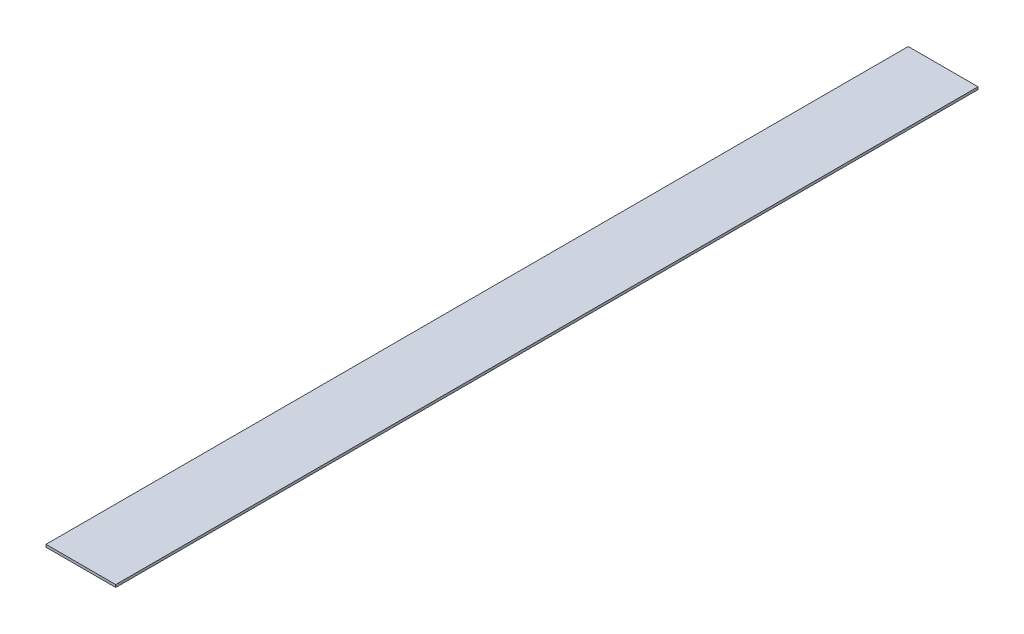
ISO-10303-21;
HEADER;
FILE_DESCRIPTION(('STEP AP214'),'2;1');
FILE_NAME('part.step','',(''),(''),'','','');
FILE_SCHEMA(('AUTOMOTIVE_DESIGN { 1 0 10303 214 1 1 1 1 }'));
ENDSEC;
DATA;
#1=APPLICATION_CONTEXT('core data for automotive mechanical design processes');
#2=APPLICATION_PROTOCOL_DEFINITION('international standard','automotive_design',2000,#1);
#3=PRODUCT_CONTEXT('',#1,'mechanical');
#4=PRODUCT('Part','Part','',(#3));
#5=PRODUCT_RELATED_PRODUCT_CATEGORY('part','',(#4));
#6=PRODUCT_DEFINITION_FORMATION('','',#4);
#7=PRODUCT_DEFINITION_CONTEXT('part definition',#1,'design');
#8=PRODUCT_DEFINITION('design','',#6,#7);
#9=PRODUCT_DEFINITION_SHAPE('','',#8);
#10=(LENGTH_UNIT() NAMED_UNIT(*) SI_UNIT(.MILLI.,.METRE.));
#11=(NAMED_UNIT(*) PLANE_ANGLE_UNIT() SI_UNIT($,.RADIAN.));
#12=(NAMED_UNIT(*) SI_UNIT($,.STERADIAN.) SOLID_ANGLE_UNIT());
#13=UNCERTAINTY_MEASURE_WITH_UNIT(LENGTH_MEASURE(1.E-05),#10,'distance_accuracy_value','');
#14=(GEOMETRIC_REPRESENTATION_CONTEXT(3) GLOBAL_UNCERTAINTY_ASSIGNED_CONTEXT((#13)) GLOBAL_UNIT_ASSIGNED_CONTEXT((#10,
#11,#12)) REPRESENTATION_CONTEXT('',''));
#15=CARTESIAN_POINT('',(0.,0.,0.));
#16=DIRECTION('',(0.,0.,1.));
#17=DIRECTION('',(1.,0.,0.));
#18=AXIS2_PLACEMENT_3D('',#15,#16,#17);
#19=CARTESIAN_POINT('',(-27.5,-1.,560.));
#20=DIRECTION('',(-1.,0.,0.));
#21=DIRECTION('',(0.,0.,1.));
#22=AXIS2_PLACEMENT_3D('',#19,#20,#21);
#23=PLANE('',#22);
#24=DIRECTION('',(0.,-1.,0.));
#25=VECTOR('',#24,1.);
#26=CARTESIAN_POINT('',(-27.5,-1.,80.));
#27=LINE('',#26,#25);
#28=CARTESIAN_POINT('',(-27.5,1.,80.));
#29=VERTEX_POINT('',#28);
#30=CARTESIAN_POINT('',(-27.5,-1.,80.));
#31=VERTEX_POINT('',#30);
#32=EDGE_CURVE('E98',#29,#31,#27,.T.);
#33=ORIENTED_EDGE('',*,*,#32,.F.);
#34=DIRECTION('',(0.,0.,-1.));
#35=VECTOR('',#34,1.);
#36=CARTESIAN_POINT('',(-27.5,1.,560.));
#37=LINE('',#36,#35);
#38=CARTESIAN_POINT('',(-27.5,1.,-600.));
#39=VERTEX_POINT('',#38);
#40=EDGE_CURVE('E105',#29,#39,#37,.T.);
#41=ORIENTED_EDGE('',*,*,#40,.T.);
#42=DIRECTION('',(0.,1.,0.));
#43=VECTOR('',#42,1.);
#44=CARTESIAN_POINT('',(-27.5,-1.,-600.));
#45=LINE('',#44,#43);
#46=CARTESIAN_POINT('',(-27.5,-1.,-600.));
#47=VERTEX_POINT('',#46);
#48=EDGE_CURVE('E114',#47,#39,#45,.T.);
#49=ORIENTED_EDGE('',*,*,#48,.F.);
#50=DIRECTION('',(0.,0.,-1.));
#51=VECTOR('',#50,1.);
#52=CARTESIAN_POINT('',(-27.5,-1.,560.));
#53=LINE('',#52,#51);
#54=EDGE_CURVE('E66',#31,#47,#53,.T.);
#55=ORIENTED_EDGE('',*,*,#54,.F.);
#56=EDGE_LOOP('',(#33,#41,#49,#55));
#57=FACE_BOUND('',#56,.T.);
#58=ADVANCED_FACE('F57',(#57),#23,.T.);
#59=CARTESIAN_POINT('',(27.5,1.00000000000001,560.));
#60=DIRECTION('',(1.,0.,0.));
#61=DIRECTION('',(0.,0.,-1.));
#62=AXIS2_PLACEMENT_3D('',#59,#60,#61);
#63=PLANE('',#62);
#64=DIRECTION('',(0.,1.,0.));
#65=VECTOR('',#64,1.);
#66=CARTESIAN_POINT('',(27.5,-0.99999999999999,80.));
#67=LINE('',#66,#65);
#68=CARTESIAN_POINT('',(27.5,-0.99999999999999,80.));
#69=VERTEX_POINT('',#68);
#70=CARTESIAN_POINT('',(27.5,1.00000000000001,80.));
#71=VERTEX_POINT('',#70);
#72=EDGE_CURVE('E80',#69,#71,#67,.T.);
#73=ORIENTED_EDGE('',*,*,#72,.F.);
#74=DIRECTION('',(0.,0.,-1.));
#75=VECTOR('',#74,1.);
#76=CARTESIAN_POINT('',(27.5,-0.99999999999999,560.));
#77=LINE('',#76,#75);
#78=CARTESIAN_POINT('',(27.5,-0.99999999999999,-600.));
#79=VERTEX_POINT('',#78);
#80=EDGE_CURVE('E61',#69,#79,#77,.T.);
#81=ORIENTED_EDGE('',*,*,#80,.T.);
#82=DIRECTION('',(0.,-1.,0.));
#83=VECTOR('',#82,1.);
#84=CARTESIAN_POINT('',(27.5,1.00000000000001,-600.));
#85=LINE('',#84,#83);
#86=CARTESIAN_POINT('',(27.5,1.00000000000001,-600.));
#87=VERTEX_POINT('',#86);
#88=EDGE_CURVE('E107',#87,#79,#85,.T.);
#89=ORIENTED_EDGE('',*,*,#88,.F.);
#90=DIRECTION('',(0.,0.,-1.));
#91=VECTOR('',#90,1.);
#92=CARTESIAN_POINT('',(27.5,1.00000000000001,560.));
#93=LINE('',#92,#91);
#94=EDGE_CURVE('E118',#71,#87,#93,.T.);
#95=ORIENTED_EDGE('',*,*,#94,.F.);
#96=EDGE_LOOP('',(#73,#81,#89,#95));
#97=FACE_BOUND('',#96,.T.);
#98=ADVANCED_FACE('F131',(#97),#63,.T.);
#99=CARTESIAN_POINT('',(27.5,-0.99999999999999,80.));
#100=DIRECTION('',(0.,0.,-1.));
#101=DIRECTION('',(-1.,0.,0.));
#102=AXIS2_PLACEMENT_3D('',#99,#100,#101);
#103=PLANE('',#102);
#104=DIRECTION('',(-1.,0.,0.));
#105=VECTOR('',#104,1.);
#106=CARTESIAN_POINT('',(27.5,1.00000000000001,80.));
#107=LINE('',#106,#105);
#108=EDGE_CURVE('E95',#71,#29,#107,.T.);
#109=ORIENTED_EDGE('',*,*,#108,.T.);
#110=ORIENTED_EDGE('',*,*,#32,.T.);
#111=DIRECTION('',(-1.,0.,0.));
#112=VECTOR('',#111,1.);
#113=CARTESIAN_POINT('',(27.5,-0.99999999999999,80.));
#114=LINE('',#113,#112);
#115=EDGE_CURVE('E12',#69,#31,#114,.T.);
#116=ORIENTED_EDGE('',*,*,#115,.F.);
#117=ORIENTED_EDGE('',*,*,#72,.T.);
#118=EDGE_LOOP('',(#109,#110,#116,#117));
#119=FACE_BOUND('',#118,.T.);
#120=ADVANCED_FACE('F97',(#119),#103,.F.);
#121=CARTESIAN_POINT('',(-27.5,1.,560.));
#122=DIRECTION('',(0.,1.,0.));
#123=DIRECTION('',(-1.,0.,0.));
#124=AXIS2_PLACEMENT_3D('',#121,#122,#123);
#125=PLANE('',#124);
#126=ORIENTED_EDGE('',*,*,#40,.F.);
#127=ORIENTED_EDGE('',*,*,#108,.F.);
#128=ORIENTED_EDGE('',*,*,#94,.T.);
#129=DIRECTION('',(1.,0.,0.));
#130=VECTOR('',#129,1.);
#131=CARTESIAN_POINT('',(-27.5,1.,-600.));
#132=LINE('',#131,#130);
#133=EDGE_CURVE('E112',#39,#87,#132,.T.);
#134=ORIENTED_EDGE('',*,*,#133,.F.);
#135=EDGE_LOOP('',(#126,#127,#128,#134));
#136=FACE_BOUND('',#135,.T.);
#137=ADVANCED_FACE('F110',(#136),#125,.T.);
#138=CARTESIAN_POINT('',(-27.5,-1.,560.));
#139=DIRECTION('',(0.,1.,0.));
#140=DIRECTION('',(-1.,0.,0.));
#141=AXIS2_PLACEMENT_3D('',#138,#139,#140);
#142=PLANE('',#141);
#143=ORIENTED_EDGE('',*,*,#115,.T.);
#144=ORIENTED_EDGE('',*,*,#54,.T.);
#145=DIRECTION('',(-1.,0.,0.));
#146=VECTOR('',#145,1.);
#147=CARTESIAN_POINT('',(27.5,-0.99999999999999,-600.));
#148=LINE('',#147,#146);
#149=EDGE_CURVE('E124',#79,#47,#148,.T.);
#150=ORIENTED_EDGE('',*,*,#149,.F.);
#151=ORIENTED_EDGE('',*,*,#80,.F.);
#152=EDGE_LOOP('',(#143,#144,#150,#151));
#153=FACE_BOUND('',#152,.T.);
#154=ADVANCED_FACE('F59',(#153),#142,.F.);
#155=CARTESIAN_POINT('',(0.,0.,-600.));
#156=DIRECTION('',(0.,0.,-1.));
#157=DIRECTION('',(-1.,0.,0.));
#158=AXIS2_PLACEMENT_3D('',#155,#156,#157);
#159=PLANE('',#158);
#160=ORIENTED_EDGE('',*,*,#88,.T.);
#161=ORIENTED_EDGE('',*,*,#149,.T.);
#162=ORIENTED_EDGE('',*,*,#48,.T.);
#163=ORIENTED_EDGE('',*,*,#133,.T.);
#164=EDGE_LOOP('',(#160,#161,#162,#163));
#165=FACE_BOUND('',#164,.T.);
#166=ADVANCED_FACE('F129',(#165),#159,.T.);
#167=CLOSED_SHELL('',(#58,#98,#120,#137,#154,#166));
#168=MANIFOLD_SOLID_BREP('B2',#167);
#169=ADVANCED_BREP_SHAPE_REPRESENTATION('',(#18,#168),#14);
#170=SHAPE_DEFINITION_REPRESENTATION(#9,#169);
ENDSEC;
END-ISO-10303-21;
